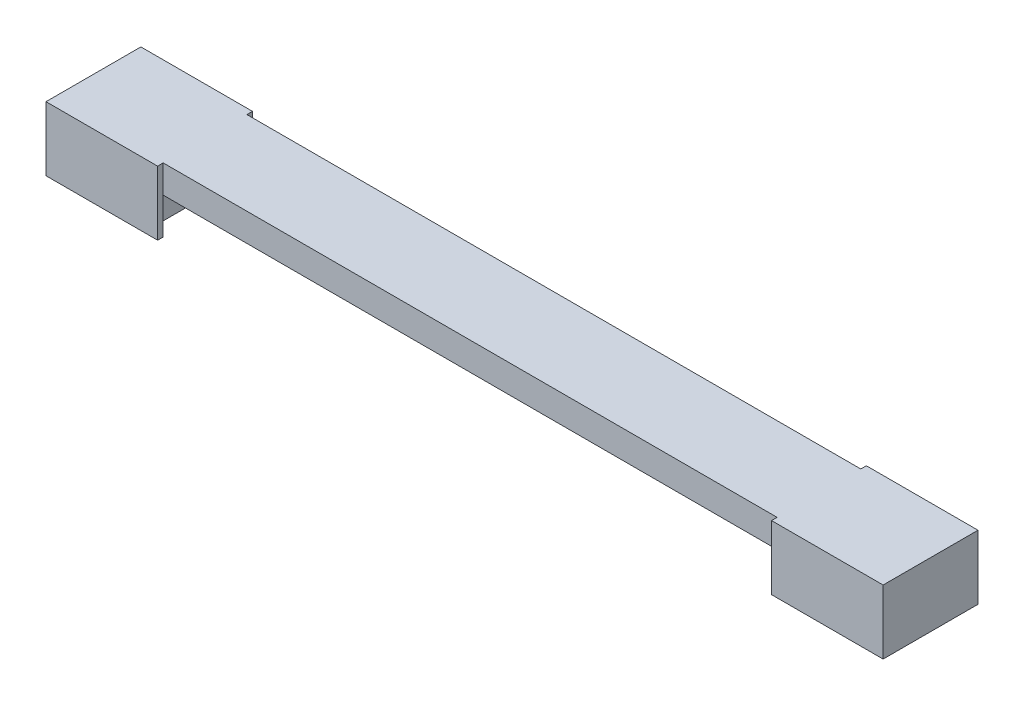
ISO-10303-21;
HEADER;
FILE_DESCRIPTION(('STEP AP214'),'2;1');
FILE_NAME('part.step','',(''),(''),'','','');
FILE_SCHEMA(('AUTOMOTIVE_DESIGN { 1 0 10303 214 1 1 1 1 }'));
ENDSEC;
DATA;
#1=APPLICATION_CONTEXT('core data for automotive mechanical design processes');
#2=APPLICATION_PROTOCOL_DEFINITION('international standard','automotive_design',2000,#1);
#3=PRODUCT_CONTEXT('',#1,'mechanical');
#4=PRODUCT('Part','Part','',(#3));
#5=PRODUCT_RELATED_PRODUCT_CATEGORY('part','',(#4));
#6=PRODUCT_DEFINITION_FORMATION('','',#4);
#7=PRODUCT_DEFINITION_CONTEXT('part definition',#1,'design');
#8=PRODUCT_DEFINITION('design','',#6,#7);
#9=PRODUCT_DEFINITION_SHAPE('','',#8);
#10=(LENGTH_UNIT() NAMED_UNIT(*) SI_UNIT(.MILLI.,.METRE.));
#11=(NAMED_UNIT(*) PLANE_ANGLE_UNIT() SI_UNIT($,.RADIAN.));
#12=(NAMED_UNIT(*) SI_UNIT($,.STERADIAN.) SOLID_ANGLE_UNIT());
#13=UNCERTAINTY_MEASURE_WITH_UNIT(LENGTH_MEASURE(1.E-05),#10,'distance_accuracy_value','');
#14=(GEOMETRIC_REPRESENTATION_CONTEXT(3) GLOBAL_UNCERTAINTY_ASSIGNED_CONTEXT((#13)) GLOBAL_UNIT_ASSIGNED_CONTEXT((#10,
#11,#12)) REPRESENTATION_CONTEXT('',''));
#15=CARTESIAN_POINT('',(0.,0.,0.));
#16=DIRECTION('',(0.,0.,1.));
#17=DIRECTION('',(1.,0.,0.));
#18=AXIS2_PLACEMENT_3D('',#15,#16,#17);
#19=CARTESIAN_POINT('',(0.,0.,15.));
#20=DIRECTION('',(0.,0.,1.));
#21=DIRECTION('',(1.,0.,0.));
#22=AXIS2_PLACEMENT_3D('',#19,#20,#21);
#23=PLANE('',#22);
#24=DIRECTION('',(-1.,0.,0.));
#25=VECTOR('',#24,1.);
#26=CARTESIAN_POINT('',(-74.,0.,15.));
#27=LINE('',#26,#25);
#28=CARTESIAN_POINT('',(55.,0.,15.));
#29=VERTEX_POINT('',#28);
#30=CARTESIAN_POINT('',(-55.,0.,15.));
#31=VERTEX_POINT('',#30);
#32=EDGE_CURVE('E313',#29,#31,#27,.T.);
#33=ORIENTED_EDGE('',*,*,#32,.T.);
#34=DIRECTION('',(0.,-1.,0.));
#35=VECTOR('',#34,1.);
#36=CARTESIAN_POINT('',(-55.,26.2488094968134,15.));
#37=LINE('',#36,#35);
#38=CARTESIAN_POINT('',(-55.,-5.,15.));
#39=VERTEX_POINT('',#38);
#40=EDGE_CURVE('E252',#31,#39,#37,.T.);
#41=ORIENTED_EDGE('',*,*,#40,.T.);
#42=DIRECTION('',(1.,0.,0.));
#43=VECTOR('',#42,1.);
#44=CARTESIAN_POINT('',(-56.,-5.,15.));
#45=LINE('',#44,#43);
#46=CARTESIAN_POINT('',(55.,-5.,15.));
#47=VERTEX_POINT('',#46);
#48=EDGE_CURVE('E324',#39,#47,#45,.T.);
#49=ORIENTED_EDGE('',*,*,#48,.T.);
#50=DIRECTION('',(0.,-1.,0.));
#51=VECTOR('',#50,1.);
#52=CARTESIAN_POINT('',(55.,26.2488094968134,15.));
#53=LINE('',#52,#51);
#54=EDGE_CURVE('E296',#29,#47,#53,.T.);
#55=ORIENTED_EDGE('',*,*,#54,.F.);
#56=EDGE_LOOP('',(#33,#41,#49,#55));
#57=FACE_BOUND('',#56,.T.);
#58=ADVANCED_FACE('F33',(#57),#23,.T.);
#59=CARTESIAN_POINT('',(0.,0.,0.));
#60=DIRECTION('',(0.,0.,1.));
#61=DIRECTION('',(1.,0.,0.));
#62=AXIS2_PLACEMENT_3D('',#59,#60,#61);
#63=PLANE('',#62);
#64=DIRECTION('',(0.,-1.,0.));
#65=VECTOR('',#64,1.);
#66=CARTESIAN_POINT('',(-55.,26.2488094968134,0.));
#67=LINE('',#66,#65);
#68=CARTESIAN_POINT('',(-55.,0.,0.));
#69=VERTEX_POINT('',#68);
#70=CARTESIAN_POINT('',(-55.,-5.,0.));
#71=VERTEX_POINT('',#70);
#72=EDGE_CURVE('E229',#69,#71,#67,.T.);
#73=ORIENTED_EDGE('',*,*,#72,.F.);
#74=DIRECTION('',(-1.,0.,0.));
#75=VECTOR('',#74,1.);
#76=CARTESIAN_POINT('',(-74.,0.,0.));
#77=LINE('',#76,#75);
#78=CARTESIAN_POINT('',(55.,0.,0.));
#79=VERTEX_POINT('',#78);
#80=EDGE_CURVE('E330',#79,#69,#77,.T.);
#81=ORIENTED_EDGE('',*,*,#80,.F.);
#82=DIRECTION('',(0.,-1.,0.));
#83=VECTOR('',#82,1.);
#84=CARTESIAN_POINT('',(55.,26.2488094968134,0.));
#85=LINE('',#84,#83);
#86=CARTESIAN_POINT('',(55.,-5.,0.));
#87=VERTEX_POINT('',#86);
#88=EDGE_CURVE('E48',#79,#87,#85,.T.);
#89=ORIENTED_EDGE('',*,*,#88,.T.);
#90=DIRECTION('',(1.,0.,0.));
#91=VECTOR('',#90,1.);
#92=CARTESIAN_POINT('',(-56.,-5.,0.));
#93=LINE('',#92,#91);
#94=EDGE_CURVE('E340',#71,#87,#93,.T.);
#95=ORIENTED_EDGE('',*,*,#94,.F.);
#96=EDGE_LOOP('',(#73,#81,#89,#95));
#97=FACE_BOUND('',#96,.T.);
#98=ADVANCED_FACE('F372',(#97),#63,.F.);
#99=CARTESIAN_POINT('',(56.,-5.,15.));
#100=DIRECTION('',(1.,0.,0.));
#101=DIRECTION('',(0.,1.,0.));
#102=AXIS2_PLACEMENT_3D('',#99,#100,#101);
#103=PLANE('',#102);
#104=DIRECTION('',(0.,-1.,0.));
#105=VECTOR('',#104,1.);
#106=CARTESIAN_POINT('',(56.,-5.,0.));
#107=LINE('',#106,#105);
#108=CARTESIAN_POINT('',(56.,-5.,0.));
#109=VERTEX_POINT('',#108);
#110=CARTESIAN_POINT('',(56.,-10.,0.));
#111=VERTEX_POINT('',#110);
#112=EDGE_CURVE('E292',#109,#111,#107,.T.);
#113=ORIENTED_EDGE('',*,*,#112,.T.);
#114=DIRECTION('',(0.,0.,-1.));
#115=VECTOR('',#114,1.);
#116=CARTESIAN_POINT('',(56.,-10.,15.));
#117=LINE('',#116,#115);
#118=CARTESIAN_POINT('',(56.,-10.,15.));
#119=VERTEX_POINT('',#118);
#120=EDGE_CURVE('E11',#119,#111,#117,.T.);
#121=ORIENTED_EDGE('',*,*,#120,.F.);
#122=DIRECTION('',(0.,-1.,0.));
#123=VECTOR('',#122,1.);
#124=CARTESIAN_POINT('',(56.,-5.,15.));
#125=LINE('',#124,#123);
#126=CARTESIAN_POINT('',(56.,-5.,15.));
#127=VERTEX_POINT('',#126);
#128=EDGE_CURVE('E56',#127,#119,#125,.T.);
#129=ORIENTED_EDGE('',*,*,#128,.F.);
#130=DIRECTION('',(0.,0.,-1.));
#131=VECTOR('',#130,1.);
#132=CARTESIAN_POINT('',(56.,-5.,15.));
#133=LINE('',#132,#131);
#134=EDGE_CURVE('E323',#127,#109,#133,.T.);
#135=ORIENTED_EDGE('',*,*,#134,.T.);
#136=EDGE_LOOP('',(#113,#121,#129,#135));
#137=FACE_BOUND('',#136,.T.);
#138=ADVANCED_FACE('F35',(#137),#103,.F.);
#139=CARTESIAN_POINT('',(56.,-10.,15.));
#140=DIRECTION('',(0.,1.,0.));
#141=DIRECTION('',(-1.,0.,0.));
#142=AXIS2_PLACEMENT_3D('',#139,#140,#141);
#143=PLANE('',#142);
#144=DIRECTION('',(1.,0.,0.));
#145=VECTOR('',#144,1.);
#146=CARTESIAN_POINT('',(56.,-10.,0.));
#147=LINE('',#146,#145);
#148=CARTESIAN_POINT('',(74.,-10.,0.));
#149=VERTEX_POINT('',#148);
#150=EDGE_CURVE('E327',#111,#149,#147,.T.);
#151=ORIENTED_EDGE('',*,*,#150,.T.);
#152=DIRECTION('',(0.,0.,-1.));
#153=VECTOR('',#152,1.);
#154=CARTESIAN_POINT('',(74.,-10.,15.));
#155=LINE('',#154,#153);
#156=CARTESIAN_POINT('',(74.,-10.,15.));
#157=VERTEX_POINT('',#156);
#158=EDGE_CURVE('E41',#157,#149,#155,.T.);
#159=ORIENTED_EDGE('',*,*,#158,.F.);
#160=DIRECTION('',(1.,0.,0.));
#161=VECTOR('',#160,1.);
#162=CARTESIAN_POINT('',(56.,-10.,15.));
#163=LINE('',#162,#161);
#164=EDGE_CURVE('E310',#119,#157,#163,.T.);
#165=ORIENTED_EDGE('',*,*,#164,.F.);
#166=ORIENTED_EDGE('',*,*,#120,.T.);
#167=EDGE_LOOP('',(#151,#159,#165,#166));
#168=FACE_BOUND('',#167,.T.);
#169=ADVANCED_FACE('F360',(#168),#143,.F.);
#170=CARTESIAN_POINT('',(-74.,0.,15.));
#171=DIRECTION('',(0.,-1.,0.));
#172=DIRECTION('',(1.,0.,0.));
#173=AXIS2_PLACEMENT_3D('',#170,#171,#172);
#174=PLANE('',#173);
#175=DIRECTION('',(0.,0.,1.));
#176=VECTOR('',#175,1.);
#177=CARTESIAN_POINT('',(-55.,0.,15.));
#178=LINE('',#177,#176);
#179=CARTESIAN_POINT('',(-55.,0.,16.));
#180=VERTEX_POINT('',#179);
#181=EDGE_CURVE('E225',#31,#180,#178,.T.);
#182=ORIENTED_EDGE('',*,*,#181,.F.);
#183=ORIENTED_EDGE('',*,*,#32,.F.);
#184=DIRECTION('',(0.,0.,1.));
#185=VECTOR('',#184,1.);
#186=CARTESIAN_POINT('',(55.,0.,15.));
#187=LINE('',#186,#185);
#188=CARTESIAN_POINT('',(55.,0.,16.));
#189=VERTEX_POINT('',#188);
#190=EDGE_CURVE('E290',#29,#189,#187,.T.);
#191=ORIENTED_EDGE('',*,*,#190,.T.);
#192=DIRECTION('',(1.,0.,0.));
#193=VECTOR('',#192,1.);
#194=CARTESIAN_POINT('',(56.,0.,16.));
#195=LINE('',#194,#193);
#196=CARTESIAN_POINT('',(75.,0.,16.));
#197=VERTEX_POINT('',#196);
#198=EDGE_CURVE('E288',#189,#197,#195,.T.);
#199=ORIENTED_EDGE('',*,*,#198,.T.);
#200=DIRECTION('',(0.,0.,-1.));
#201=VECTOR('',#200,1.);
#202=CARTESIAN_POINT('',(75.,0.,-1.));
#203=LINE('',#202,#201);
#204=CARTESIAN_POINT('',(75.,0.,-1.));
#205=VERTEX_POINT('',#204);
#206=EDGE_CURVE('E286',#197,#205,#203,.T.);
#207=ORIENTED_EDGE('',*,*,#206,.T.);
#208=DIRECTION('',(-1.,0.,0.));
#209=VECTOR('',#208,1.);
#210=CARTESIAN_POINT('',(56.,0.,-1.));
#211=LINE('',#210,#209);
#212=CARTESIAN_POINT('',(55.,0.,-1.));
#213=VERTEX_POINT('',#212);
#214=EDGE_CURVE('E283',#205,#213,#211,.T.);
#215=ORIENTED_EDGE('',*,*,#214,.T.);
#216=DIRECTION('',(0.,0.,1.));
#217=VECTOR('',#216,1.);
#218=CARTESIAN_POINT('',(55.,0.,0.));
#219=LINE('',#218,#217);
#220=EDGE_CURVE('E281',#213,#79,#219,.T.);
#221=ORIENTED_EDGE('',*,*,#220,.T.);
#222=ORIENTED_EDGE('',*,*,#80,.T.);
#223=DIRECTION('',(0.,0.,1.));
#224=VECTOR('',#223,1.);
#225=CARTESIAN_POINT('',(-55.,0.,0.));
#226=LINE('',#225,#224);
#227=CARTESIAN_POINT('',(-55.,0.,-1.));
#228=VERTEX_POINT('',#227);
#229=EDGE_CURVE('E238',#228,#69,#226,.T.);
#230=ORIENTED_EDGE('',*,*,#229,.F.);
#231=DIRECTION('',(1.,0.,0.));
#232=VECTOR('',#231,1.);
#233=CARTESIAN_POINT('',(-56.,0.,-1.));
#234=LINE('',#233,#232);
#235=CARTESIAN_POINT('',(-75.,0.,-1.));
#236=VERTEX_POINT('',#235);
#237=EDGE_CURVE('E235',#236,#228,#234,.T.);
#238=ORIENTED_EDGE('',*,*,#237,.F.);
#239=DIRECTION('',(0.,0.,-1.));
#240=VECTOR('',#239,1.);
#241=CARTESIAN_POINT('',(-75.,0.,-1.));
#242=LINE('',#241,#240);
#243=CARTESIAN_POINT('',(-75.,0.,16.));
#244=VERTEX_POINT('',#243);
#245=EDGE_CURVE('E232',#244,#236,#242,.T.);
#246=ORIENTED_EDGE('',*,*,#245,.F.);
#247=DIRECTION('',(-1.,0.,0.));
#248=VECTOR('',#247,1.);
#249=CARTESIAN_POINT('',(-75.,0.,16.));
#250=LINE('',#249,#248);
#251=EDGE_CURVE('E228',#180,#244,#250,.T.);
#252=ORIENTED_EDGE('',*,*,#251,.F.);
#253=EDGE_LOOP('',(#182,#183,#191,#199,#207,#215,#221,#222,#230,#238,#246,#252));
#254=FACE_BOUND('',#253,.T.);
#255=ADVANCED_FACE('F375',(#254),#174,.F.);
#256=CARTESIAN_POINT('',(-56.,-10.,15.));
#257=DIRECTION('',(0.,1.,0.));
#258=DIRECTION('',(-1.,0.,0.));
#259=AXIS2_PLACEMENT_3D('',#256,#257,#258);
#260=PLANE('',#259);
#261=DIRECTION('',(1.,0.,0.));
#262=VECTOR('',#261,1.);
#263=CARTESIAN_POINT('',(-56.,-10.,0.));
#264=LINE('',#263,#262);
#265=CARTESIAN_POINT('',(-74.,-10.,0.));
#266=VERTEX_POINT('',#265);
#267=CARTESIAN_POINT('',(-56.,-10.,0.));
#268=VERTEX_POINT('',#267);
#269=EDGE_CURVE('E190',#266,#268,#264,.T.);
#270=ORIENTED_EDGE('',*,*,#269,.T.);
#271=DIRECTION('',(0.,0.,-1.));
#272=VECTOR('',#271,1.);
#273=CARTESIAN_POINT('',(-56.,-10.,15.));
#274=LINE('',#273,#272);
#275=CARTESIAN_POINT('',(-56.,-10.,15.));
#276=VERTEX_POINT('',#275);
#277=EDGE_CURVE('E346',#276,#268,#274,.T.);
#278=ORIENTED_EDGE('',*,*,#277,.F.);
#279=DIRECTION('',(1.,0.,0.));
#280=VECTOR('',#279,1.);
#281=CARTESIAN_POINT('',(-56.,-10.,15.));
#282=LINE('',#281,#280);
#283=CARTESIAN_POINT('',(-74.,-10.,15.));
#284=VERTEX_POINT('',#283);
#285=EDGE_CURVE('E316',#284,#276,#282,.T.);
#286=ORIENTED_EDGE('',*,*,#285,.F.);
#287=DIRECTION('',(0.,0.,-1.));
#288=VECTOR('',#287,1.);
#289=CARTESIAN_POINT('',(-74.,-10.,15.));
#290=LINE('',#289,#288);
#291=EDGE_CURVE('E349',#284,#266,#290,.T.);
#292=ORIENTED_EDGE('',*,*,#291,.T.);
#293=EDGE_LOOP('',(#270,#278,#286,#292));
#294=FACE_BOUND('',#293,.T.);
#295=ADVANCED_FACE('F435',(#294),#260,.F.);
#296=CARTESIAN_POINT('',(-56.,-5.,15.));
#297=DIRECTION('',(-1.,0.,0.));
#298=DIRECTION('',(0.,-1.,0.));
#299=AXIS2_PLACEMENT_3D('',#296,#297,#298);
#300=PLANE('',#299);
#301=DIRECTION('',(0.,1.,0.));
#302=VECTOR('',#301,1.);
#303=CARTESIAN_POINT('',(-56.,-5.,0.));
#304=LINE('',#303,#302);
#305=CARTESIAN_POINT('',(-56.,-5.,0.));
#306=VERTEX_POINT('',#305);
#307=EDGE_CURVE('E334',#268,#306,#304,.T.);
#308=ORIENTED_EDGE('',*,*,#307,.T.);
#309=DIRECTION('',(0.,0.,-1.));
#310=VECTOR('',#309,1.);
#311=CARTESIAN_POINT('',(-56.,-5.,15.));
#312=LINE('',#311,#310);
#313=CARTESIAN_POINT('',(-56.,-5.,15.));
#314=VERTEX_POINT('',#313);
#315=EDGE_CURVE('E343',#314,#306,#312,.T.);
#316=ORIENTED_EDGE('',*,*,#315,.F.);
#317=DIRECTION('',(0.,1.,0.));
#318=VECTOR('',#317,1.);
#319=CARTESIAN_POINT('',(-56.,-5.,15.));
#320=LINE('',#319,#318);
#321=EDGE_CURVE('E318',#276,#314,#320,.T.);
#322=ORIENTED_EDGE('',*,*,#321,.F.);
#323=ORIENTED_EDGE('',*,*,#277,.T.);
#324=EDGE_LOOP('',(#308,#316,#322,#323));
#325=FACE_BOUND('',#324,.T.);
#326=ADVANCED_FACE('F431',(#325),#300,.F.);
#327=CARTESIAN_POINT('',(-56.,-5.,15.));
#328=DIRECTION('',(0.,1.,0.));
#329=DIRECTION('',(0.,0.,1.));
#330=AXIS2_PLACEMENT_3D('',#327,#328,#329);
#331=PLANE('',#330);
#332=EDGE_CURVE('E311',#306,#71,#93,.T.);
#333=ORIENTED_EDGE('',*,*,#332,.T.);
#334=ORIENTED_EDGE('',*,*,#94,.T.);
#335=EDGE_CURVE('E337',#87,#109,#93,.T.);
#336=ORIENTED_EDGE('',*,*,#335,.T.);
#337=ORIENTED_EDGE('',*,*,#134,.F.);
#338=EDGE_CURVE('E320',#47,#127,#45,.T.);
#339=ORIENTED_EDGE('',*,*,#338,.F.);
#340=ORIENTED_EDGE('',*,*,#48,.F.);
#341=EDGE_CURVE('E321',#314,#39,#45,.T.);
#342=ORIENTED_EDGE('',*,*,#341,.F.);
#343=ORIENTED_EDGE('',*,*,#315,.T.);
#344=EDGE_LOOP('',(#333,#334,#336,#337,#339,#340,#342,#343));
#345=FACE_BOUND('',#344,.T.);
#346=ADVANCED_FACE('F367',(#345),#331,.F.);
#347=CARTESIAN_POINT('',(74.,26.2488094968134,15.));
#348=DIRECTION('',(0.,0.,-1.));
#349=DIRECTION('',(-1.,0.,0.));
#350=AXIS2_PLACEMENT_3D('',#347,#348,#349);
#351=PLANE('',#350);
#352=ORIENTED_EDGE('',*,*,#164,.T.);
#353=DIRECTION('',(0.,-1.,0.));
#354=VECTOR('',#353,1.);
#355=CARTESIAN_POINT('',(74.,26.2488094968134,15.));
#356=LINE('',#355,#354);
#357=CARTESIAN_POINT('',(74.,-11.5,15.));
#358=VERTEX_POINT('',#357);
#359=EDGE_CURVE('E294',#157,#358,#356,.T.);
#360=ORIENTED_EDGE('',*,*,#359,.T.);
#361=DIRECTION('',(1.,0.,0.));
#362=VECTOR('',#361,1.);
#363=CARTESIAN_POINT('',(56.,-11.5,15.));
#364=LINE('',#363,#362);
#365=CARTESIAN_POINT('',(55.,-11.5,15.));
#366=VERTEX_POINT('',#365);
#367=EDGE_CURVE('E274',#366,#358,#364,.T.);
#368=ORIENTED_EDGE('',*,*,#367,.F.);
#369=EDGE_CURVE('E299',#47,#366,#53,.T.);
#370=ORIENTED_EDGE('',*,*,#369,.F.);
#371=ORIENTED_EDGE('',*,*,#338,.T.);
#372=ORIENTED_EDGE('',*,*,#128,.T.);
#373=EDGE_LOOP('',(#352,#360,#368,#370,#371,#372));
#374=FACE_BOUND('',#373,.T.);
#375=ADVANCED_FACE('F403',(#374),#351,.T.);
#376=CARTESIAN_POINT('',(56.,26.2488094968134,0.));
#377=DIRECTION('',(0.,0.,1.));
#378=DIRECTION('',(1.,0.,0.));
#379=AXIS2_PLACEMENT_3D('',#376,#377,#378);
#380=PLANE('',#379);
#381=ORIENTED_EDGE('',*,*,#150,.F.);
#382=ORIENTED_EDGE('',*,*,#112,.F.);
#383=ORIENTED_EDGE('',*,*,#335,.F.);
#384=CARTESIAN_POINT('',(55.,-11.5,0.));
#385=VERTEX_POINT('',#384);
#386=EDGE_CURVE('E280',#87,#385,#85,.T.);
#387=ORIENTED_EDGE('',*,*,#386,.T.);
#388=DIRECTION('',(-1.,0.,0.));
#389=VECTOR('',#388,1.);
#390=CARTESIAN_POINT('',(56.,-11.5,0.));
#391=LINE('',#390,#389);
#392=CARTESIAN_POINT('',(74.,-11.5,0.));
#393=VERTEX_POINT('',#392);
#394=EDGE_CURVE('E240',#393,#385,#391,.T.);
#395=ORIENTED_EDGE('',*,*,#394,.F.);
#396=DIRECTION('',(0.,-1.,0.));
#397=VECTOR('',#396,1.);
#398=CARTESIAN_POINT('',(74.,26.2488094968134,0.));
#399=LINE('',#398,#397);
#400=EDGE_CURVE('E284',#149,#393,#399,.T.);
#401=ORIENTED_EDGE('',*,*,#400,.F.);
#402=EDGE_LOOP('',(#381,#382,#383,#387,#395,#401));
#403=FACE_BOUND('',#402,.T.);
#404=ADVANCED_FACE('F359',(#403),#380,.T.);
#405=CARTESIAN_POINT('',(74.,26.2488094968134,0.));
#406=DIRECTION('',(-1.,0.,0.));
#407=DIRECTION('',(0.,-1.,0.));
#408=AXIS2_PLACEMENT_3D('',#405,#406,#407);
#409=PLANE('',#408);
#410=ORIENTED_EDGE('',*,*,#158,.T.);
#411=ORIENTED_EDGE('',*,*,#400,.T.);
#412=DIRECTION('',(0.,0.,-1.));
#413=VECTOR('',#412,1.);
#414=CARTESIAN_POINT('',(74.,-11.5,0.));
#415=LINE('',#414,#413);
#416=EDGE_CURVE('E277',#358,#393,#415,.T.);
#417=ORIENTED_EDGE('',*,*,#416,.F.);
#418=ORIENTED_EDGE('',*,*,#359,.F.);
#419=EDGE_LOOP('',(#410,#411,#417,#418));
#420=FACE_BOUND('',#419,.T.);
#421=ADVANCED_FACE('F354',(#420),#409,.T.);
#422=CARTESIAN_POINT('',(55.,26.2488094968134,15.));
#423=DIRECTION('',(-1.,0.,0.));
#424=DIRECTION('',(0.,-1.,0.));
#425=AXIS2_PLACEMENT_3D('',#422,#423,#424);
#426=PLANE('',#425);
#427=ORIENTED_EDGE('',*,*,#190,.F.);
#428=ORIENTED_EDGE('',*,*,#54,.T.);
#429=ORIENTED_EDGE('',*,*,#369,.T.);
#430=DIRECTION('',(0.,0.,-1.));
#431=VECTOR('',#430,1.);
#432=CARTESIAN_POINT('',(55.,-11.5,15.));
#433=LINE('',#432,#431);
#434=CARTESIAN_POINT('',(55.,-11.5,16.));
#435=VERTEX_POINT('',#434);
#436=EDGE_CURVE('E271',#435,#366,#433,.T.);
#437=ORIENTED_EDGE('',*,*,#436,.F.);
#438=DIRECTION('',(0.,-1.,0.));
#439=VECTOR('',#438,1.);
#440=CARTESIAN_POINT('',(55.,26.2488094968134,16.));
#441=LINE('',#440,#439);
#442=EDGE_CURVE('E300',#189,#435,#441,.T.);
#443=ORIENTED_EDGE('',*,*,#442,.F.);
#444=EDGE_LOOP('',(#427,#428,#429,#437,#443));
#445=FACE_BOUND('',#444,.T.);
#446=ADVANCED_FACE('F400',(#445),#426,.T.);
#447=CARTESIAN_POINT('',(56.,26.2488094968134,16.));
#448=DIRECTION('',(0.,0.,1.));
#449=DIRECTION('',(1.,0.,0.));
#450=AXIS2_PLACEMENT_3D('',#447,#448,#449);
#451=PLANE('',#450);
#452=ORIENTED_EDGE('',*,*,#198,.F.);
#453=ORIENTED_EDGE('',*,*,#442,.T.);
#454=DIRECTION('',(-1.,0.,0.));
#455=VECTOR('',#454,1.);
#456=CARTESIAN_POINT('',(75.,-11.5,16.));
#457=LINE('',#456,#455);
#458=CARTESIAN_POINT('',(75.,-11.5,16.));
#459=VERTEX_POINT('',#458);
#460=EDGE_CURVE('E268',#459,#435,#457,.T.);
#461=ORIENTED_EDGE('',*,*,#460,.F.);
#462=DIRECTION('',(0.,-1.,0.));
#463=VECTOR('',#462,1.);
#464=CARTESIAN_POINT('',(75.,26.2488094968134,16.));
#465=LINE('',#464,#463);
#466=EDGE_CURVE('E302',#197,#459,#465,.T.);
#467=ORIENTED_EDGE('',*,*,#466,.F.);
#468=EDGE_LOOP('',(#452,#453,#461,#467));
#469=FACE_BOUND('',#468,.T.);
#470=ADVANCED_FACE('F395',(#469),#451,.T.);
#471=CARTESIAN_POINT('',(75.,26.2488094968134,-1.));
#472=DIRECTION('',(1.,0.,0.));
#473=DIRECTION('',(0.,1.,0.));
#474=AXIS2_PLACEMENT_3D('',#471,#472,#473);
#475=PLANE('',#474);
#476=ORIENTED_EDGE('',*,*,#206,.F.);
#477=ORIENTED_EDGE('',*,*,#466,.T.);
#478=DIRECTION('',(0.,0.,1.));
#479=VECTOR('',#478,1.);
#480=CARTESIAN_POINT('',(75.,-11.5,-1.));
#481=LINE('',#480,#479);
#482=CARTESIAN_POINT('',(75.,-11.5,-1.));
#483=VERTEX_POINT('',#482);
#484=EDGE_CURVE('E265',#483,#459,#481,.T.);
#485=ORIENTED_EDGE('',*,*,#484,.F.);
#486=DIRECTION('',(0.,-1.,0.));
#487=VECTOR('',#486,1.);
#488=CARTESIAN_POINT('',(75.,26.2488094968134,-1.));
#489=LINE('',#488,#487);
#490=EDGE_CURVE('E304',#205,#483,#489,.T.);
#491=ORIENTED_EDGE('',*,*,#490,.F.);
#492=EDGE_LOOP('',(#476,#477,#485,#491));
#493=FACE_BOUND('',#492,.T.);
#494=ADVANCED_FACE('F391',(#493),#475,.T.);
#495=CARTESIAN_POINT('',(56.,26.2488094968134,-1.));
#496=DIRECTION('',(0.,0.,-1.));
#497=DIRECTION('',(-1.,0.,0.));
#498=AXIS2_PLACEMENT_3D('',#495,#496,#497);
#499=PLANE('',#498);
#500=ORIENTED_EDGE('',*,*,#214,.F.);
#501=ORIENTED_EDGE('',*,*,#490,.T.);
#502=DIRECTION('',(1.,0.,0.));
#503=VECTOR('',#502,1.);
#504=CARTESIAN_POINT('',(56.,-11.5,-1.));
#505=LINE('',#504,#503);
#506=CARTESIAN_POINT('',(55.,-11.5,-1.));
#507=VERTEX_POINT('',#506);
#508=EDGE_CURVE('E262',#507,#483,#505,.T.);
#509=ORIENTED_EDGE('',*,*,#508,.F.);
#510=DIRECTION('',(0.,-1.,0.));
#511=VECTOR('',#510,1.);
#512=CARTESIAN_POINT('',(55.,26.2488094968134,-1.));
#513=LINE('',#512,#511);
#514=EDGE_CURVE('E306',#213,#507,#513,.T.);
#515=ORIENTED_EDGE('',*,*,#514,.F.);
#516=EDGE_LOOP('',(#500,#501,#509,#515));
#517=FACE_BOUND('',#516,.T.);
#518=ADVANCED_FACE('F383',(#517),#499,.T.);
#519=CARTESIAN_POINT('',(55.,26.2488094968134,0.));
#520=DIRECTION('',(-1.,0.,0.));
#521=DIRECTION('',(0.,-1.,0.));
#522=AXIS2_PLACEMENT_3D('',#519,#520,#521);
#523=PLANE('',#522);
#524=ORIENTED_EDGE('',*,*,#220,.F.);
#525=ORIENTED_EDGE('',*,*,#514,.T.);
#526=DIRECTION('',(0.,0.,-1.));
#527=VECTOR('',#526,1.);
#528=CARTESIAN_POINT('',(55.,-11.5,0.));
#529=LINE('',#528,#527);
#530=EDGE_CURVE('E259',#385,#507,#529,.T.);
#531=ORIENTED_EDGE('',*,*,#530,.F.);
#532=ORIENTED_EDGE('',*,*,#386,.F.);
#533=ORIENTED_EDGE('',*,*,#88,.F.);
#534=EDGE_LOOP('',(#524,#525,#531,#532,#533));
#535=FACE_BOUND('',#534,.T.);
#536=ADVANCED_FACE('F379',(#535),#523,.T.);
#537=CARTESIAN_POINT('',(0.,-11.5,0.));
#538=DIRECTION('',(0.,-1.,0.));
#539=DIRECTION('',(1.,0.,0.));
#540=AXIS2_PLACEMENT_3D('',#537,#538,#539);
#541=PLANE('',#540);
#542=ORIENTED_EDGE('',*,*,#394,.T.);
#543=ORIENTED_EDGE('',*,*,#530,.T.);
#544=ORIENTED_EDGE('',*,*,#508,.T.);
#545=ORIENTED_EDGE('',*,*,#484,.T.);
#546=ORIENTED_EDGE('',*,*,#460,.T.);
#547=ORIENTED_EDGE('',*,*,#436,.T.);
#548=ORIENTED_EDGE('',*,*,#367,.T.);
#549=ORIENTED_EDGE('',*,*,#416,.T.);
#550=EDGE_LOOP('',(#542,#543,#544,#545,#546,#547,#548,#549));
#551=FACE_BOUND('',#550,.T.);
#552=ADVANCED_FACE('F387',(#551),#541,.T.);
#553=CARTESIAN_POINT('',(-56.,26.2488094968134,15.));
#554=DIRECTION('',(0.,0.,1.));
#555=DIRECTION('',(1.,0.,0.));
#556=AXIS2_PLACEMENT_3D('',#553,#554,#555);
#557=PLANE('',#556);
#558=DIRECTION('',(0.,-1.,0.));
#559=VECTOR('',#558,1.);
#560=CARTESIAN_POINT('',(-74.,26.2488094968134,15.));
#561=LINE('',#560,#559);
#562=CARTESIAN_POINT('',(-74.,-11.5,15.));
#563=VERTEX_POINT('',#562);
#564=EDGE_CURVE('E194',#284,#563,#561,.T.);
#565=ORIENTED_EDGE('',*,*,#564,.F.);
#566=ORIENTED_EDGE('',*,*,#285,.T.);
#567=ORIENTED_EDGE('',*,*,#321,.T.);
#568=ORIENTED_EDGE('',*,*,#341,.T.);
#569=CARTESIAN_POINT('',(-55.,-11.5,15.));
#570=VERTEX_POINT('',#569);
#571=EDGE_CURVE('E255',#39,#570,#37,.T.);
#572=ORIENTED_EDGE('',*,*,#571,.T.);
#573=DIRECTION('',(-1.,0.,0.));
#574=VECTOR('',#573,1.);
#575=CARTESIAN_POINT('',(-74.,-11.5,15.));
#576=LINE('',#575,#574);
#577=EDGE_CURVE('E208',#570,#563,#576,.T.);
#578=ORIENTED_EDGE('',*,*,#577,.T.);
#579=EDGE_LOOP('',(#565,#566,#567,#568,#572,#578));
#580=FACE_BOUND('',#579,.T.);
#581=ADVANCED_FACE('F412',(#580),#557,.F.);
#582=CARTESIAN_POINT('',(-56.,26.2488094968134,0.));
#583=DIRECTION('',(0.,0.,-1.));
#584=DIRECTION('',(-1.,0.,0.));
#585=AXIS2_PLACEMENT_3D('',#582,#583,#584);
#586=PLANE('',#585);
#587=ORIENTED_EDGE('',*,*,#307,.F.);
#588=ORIENTED_EDGE('',*,*,#269,.F.);
#589=DIRECTION('',(0.,-1.,0.));
#590=VECTOR('',#589,1.);
#591=CARTESIAN_POINT('',(-74.,26.2488094968134,0.));
#592=LINE('',#591,#590);
#593=CARTESIAN_POINT('',(-74.,-11.5,0.));
#594=VERTEX_POINT('',#593);
#595=EDGE_CURVE('E184',#266,#594,#592,.T.);
#596=ORIENTED_EDGE('',*,*,#595,.T.);
#597=DIRECTION('',(1.,0.,0.));
#598=VECTOR('',#597,1.);
#599=CARTESIAN_POINT('',(-56.,-11.5,0.));
#600=LINE('',#599,#598);
#601=CARTESIAN_POINT('',(-55.,-11.5,0.));
#602=VERTEX_POINT('',#601);
#603=EDGE_CURVE('E187',#594,#602,#600,.T.);
#604=ORIENTED_EDGE('',*,*,#603,.T.);
#605=EDGE_CURVE('E243',#71,#602,#67,.T.);
#606=ORIENTED_EDGE('',*,*,#605,.F.);
#607=ORIENTED_EDGE('',*,*,#332,.F.);
#608=EDGE_LOOP('',(#587,#588,#596,#604,#606,#607));
#609=FACE_BOUND('',#608,.T.);
#610=ADVANCED_FACE('F186',(#609),#586,.F.);
#611=CARTESIAN_POINT('',(-74.,26.2488094968134,0.));
#612=DIRECTION('',(-1.,0.,0.));
#613=DIRECTION('',(0.,-1.,0.));
#614=AXIS2_PLACEMENT_3D('',#611,#612,#613);
#615=PLANE('',#614);
#616=ORIENTED_EDGE('',*,*,#595,.F.);
#617=ORIENTED_EDGE('',*,*,#291,.F.);
#618=ORIENTED_EDGE('',*,*,#564,.T.);
#619=DIRECTION('',(0.,0.,-1.));
#620=VECTOR('',#619,1.);
#621=CARTESIAN_POINT('',(-74.,-11.5,0.));
#622=LINE('',#621,#620);
#623=EDGE_CURVE('E201',#563,#594,#622,.T.);
#624=ORIENTED_EDGE('',*,*,#623,.T.);
#625=EDGE_LOOP('',(#616,#617,#618,#624));
#626=FACE_BOUND('',#625,.T.);
#627=ADVANCED_FACE('F206',(#626),#615,.F.);
#628=CARTESIAN_POINT('',(-55.,26.2488094968134,15.));
#629=DIRECTION('',(-1.,0.,0.));
#630=DIRECTION('',(0.,-1.,0.));
#631=AXIS2_PLACEMENT_3D('',#628,#629,#630);
#632=PLANE('',#631);
#633=ORIENTED_EDGE('',*,*,#40,.F.);
#634=ORIENTED_EDGE('',*,*,#181,.T.);
#635=DIRECTION('',(0.,-1.,0.));
#636=VECTOR('',#635,1.);
#637=CARTESIAN_POINT('',(-55.,26.2488094968134,16.));
#638=LINE('',#637,#636);
#639=CARTESIAN_POINT('',(-55.,-11.5,16.));
#640=VERTEX_POINT('',#639);
#641=EDGE_CURVE('E250',#180,#640,#638,.T.);
#642=ORIENTED_EDGE('',*,*,#641,.T.);
#643=DIRECTION('',(0.,0.,-1.));
#644=VECTOR('',#643,1.);
#645=CARTESIAN_POINT('',(-55.,-11.5,15.));
#646=LINE('',#645,#644);
#647=EDGE_CURVE('E210',#640,#570,#646,.T.);
#648=ORIENTED_EDGE('',*,*,#647,.T.);
#649=ORIENTED_EDGE('',*,*,#571,.F.);
#650=EDGE_LOOP('',(#633,#634,#642,#648,#649));
#651=FACE_BOUND('',#650,.T.);
#652=ADVANCED_FACE('F415',(#651),#632,.F.);
#653=CARTESIAN_POINT('',(-75.,26.2488094968134,16.));
#654=DIRECTION('',(0.,0.,-1.));
#655=DIRECTION('',(-1.,0.,0.));
#656=AXIS2_PLACEMENT_3D('',#653,#654,#655);
#657=PLANE('',#656);
#658=ORIENTED_EDGE('',*,*,#641,.F.);
#659=ORIENTED_EDGE('',*,*,#251,.T.);
#660=DIRECTION('',(0.,-1.,0.));
#661=VECTOR('',#660,1.);
#662=CARTESIAN_POINT('',(-75.,26.2488094968134,16.));
#663=LINE('',#662,#661);
#664=CARTESIAN_POINT('',(-75.,-11.5,16.));
#665=VERTEX_POINT('',#664);
#666=EDGE_CURVE('E248',#244,#665,#663,.T.);
#667=ORIENTED_EDGE('',*,*,#666,.T.);
#668=DIRECTION('',(1.,0.,0.));
#669=VECTOR('',#668,1.);
#670=CARTESIAN_POINT('',(-56.,-11.5,16.));
#671=LINE('',#670,#669);
#672=EDGE_CURVE('E215',#665,#640,#671,.T.);
#673=ORIENTED_EDGE('',*,*,#672,.T.);
#674=EDGE_LOOP('',(#658,#659,#667,#673));
#675=FACE_BOUND('',#674,.T.);
#676=ADVANCED_FACE('F421',(#675),#657,.F.);
#677=CARTESIAN_POINT('',(-75.,26.2488094968134,-1.));
#678=DIRECTION('',(1.,0.,0.));
#679=DIRECTION('',(0.,1.,0.));
#680=AXIS2_PLACEMENT_3D('',#677,#678,#679);
#681=PLANE('',#680);
#682=ORIENTED_EDGE('',*,*,#666,.F.);
#683=ORIENTED_EDGE('',*,*,#245,.T.);
#684=DIRECTION('',(0.,-1.,0.));
#685=VECTOR('',#684,1.);
#686=CARTESIAN_POINT('',(-75.,26.2488094968134,-1.));
#687=LINE('',#686,#685);
#688=CARTESIAN_POINT('',(-75.,-11.5,-1.));
#689=VERTEX_POINT('',#688);
#690=EDGE_CURVE('E246',#236,#689,#687,.T.);
#691=ORIENTED_EDGE('',*,*,#690,.T.);
#692=DIRECTION('',(0.,0.,1.));
#693=VECTOR('',#692,1.);
#694=CARTESIAN_POINT('',(-75.,-11.5,-1.));
#695=LINE('',#694,#693);
#696=EDGE_CURVE('E218',#689,#665,#695,.T.);
#697=ORIENTED_EDGE('',*,*,#696,.T.);
#698=EDGE_LOOP('',(#682,#683,#691,#697));
#699=FACE_BOUND('',#698,.T.);
#700=ADVANCED_FACE('F424',(#699),#681,.F.);
#701=CARTESIAN_POINT('',(-56.,26.2488094968134,-1.));
#702=DIRECTION('',(0.,0.,1.));
#703=DIRECTION('',(1.,0.,0.));
#704=AXIS2_PLACEMENT_3D('',#701,#702,#703);
#705=PLANE('',#704);
#706=ORIENTED_EDGE('',*,*,#690,.F.);
#707=ORIENTED_EDGE('',*,*,#237,.T.);
#708=DIRECTION('',(0.,-1.,0.));
#709=VECTOR('',#708,1.);
#710=CARTESIAN_POINT('',(-55.,26.2488094968134,-1.));
#711=LINE('',#710,#709);
#712=CARTESIAN_POINT('',(-55.,-11.5,-1.));
#713=VERTEX_POINT('',#712);
#714=EDGE_CURVE('E244',#228,#713,#711,.T.);
#715=ORIENTED_EDGE('',*,*,#714,.T.);
#716=DIRECTION('',(-1.,0.,0.));
#717=VECTOR('',#716,1.);
#718=CARTESIAN_POINT('',(-56.,-11.5,-1.));
#719=LINE('',#718,#717);
#720=EDGE_CURVE('E221',#713,#689,#719,.T.);
#721=ORIENTED_EDGE('',*,*,#720,.T.);
#722=EDGE_LOOP('',(#706,#707,#715,#721));
#723=FACE_BOUND('',#722,.T.);
#724=ADVANCED_FACE('F427',(#723),#705,.F.);
#725=CARTESIAN_POINT('',(-55.,26.2488094968134,0.));
#726=DIRECTION('',(-1.,0.,0.));
#727=DIRECTION('',(0.,-1.,0.));
#728=AXIS2_PLACEMENT_3D('',#725,#726,#727);
#729=PLANE('',#728);
#730=ORIENTED_EDGE('',*,*,#714,.F.);
#731=ORIENTED_EDGE('',*,*,#229,.T.);
#732=ORIENTED_EDGE('',*,*,#72,.T.);
#733=ORIENTED_EDGE('',*,*,#605,.T.);
#734=DIRECTION('',(0.,0.,-1.));
#735=VECTOR('',#734,1.);
#736=CARTESIAN_POINT('',(-55.,-11.5,0.));
#737=LINE('',#736,#735);
#738=EDGE_CURVE('E195',#602,#713,#737,.T.);
#739=ORIENTED_EDGE('',*,*,#738,.T.);
#740=EDGE_LOOP('',(#730,#731,#732,#733,#739));
#741=FACE_BOUND('',#740,.T.);
#742=ADVANCED_FACE('F429',(#741),#729,.F.);
#743=CARTESIAN_POINT('',(0.,-11.5,0.));
#744=DIRECTION('',(0.,-1.,0.));
#745=DIRECTION('',(-1.,0.,0.));
#746=AXIS2_PLACEMENT_3D('',#743,#744,#745);
#747=PLANE('',#746);
#748=ORIENTED_EDGE('',*,*,#603,.F.);
#749=ORIENTED_EDGE('',*,*,#623,.F.);
#750=ORIENTED_EDGE('',*,*,#577,.F.);
#751=ORIENTED_EDGE('',*,*,#647,.F.);
#752=ORIENTED_EDGE('',*,*,#672,.F.);
#753=ORIENTED_EDGE('',*,*,#696,.F.);
#754=ORIENTED_EDGE('',*,*,#720,.F.);
#755=ORIENTED_EDGE('',*,*,#738,.F.);
#756=EDGE_LOOP('',(#748,#749,#750,#751,#752,#753,#754,#755));
#757=FACE_BOUND('',#756,.T.);
#758=ADVANCED_FACE('F199',(#757),#747,.T.);
#759=CLOSED_SHELL('',(#58,#98,#138,#169,#255,#295,#326,#346,#375,#404,#421,#446,#470,#494,#518,
#536,#552,#581,#610,#627,#652,#676,#700,#724,#742,#758));
#760=MANIFOLD_SOLID_BREP('B2',#759);
#761=ADVANCED_BREP_SHAPE_REPRESENTATION('',(#18,#760),#14);
#762=SHAPE_DEFINITION_REPRESENTATION(#9,#761);
ENDSEC;
END-ISO-10303-21;
